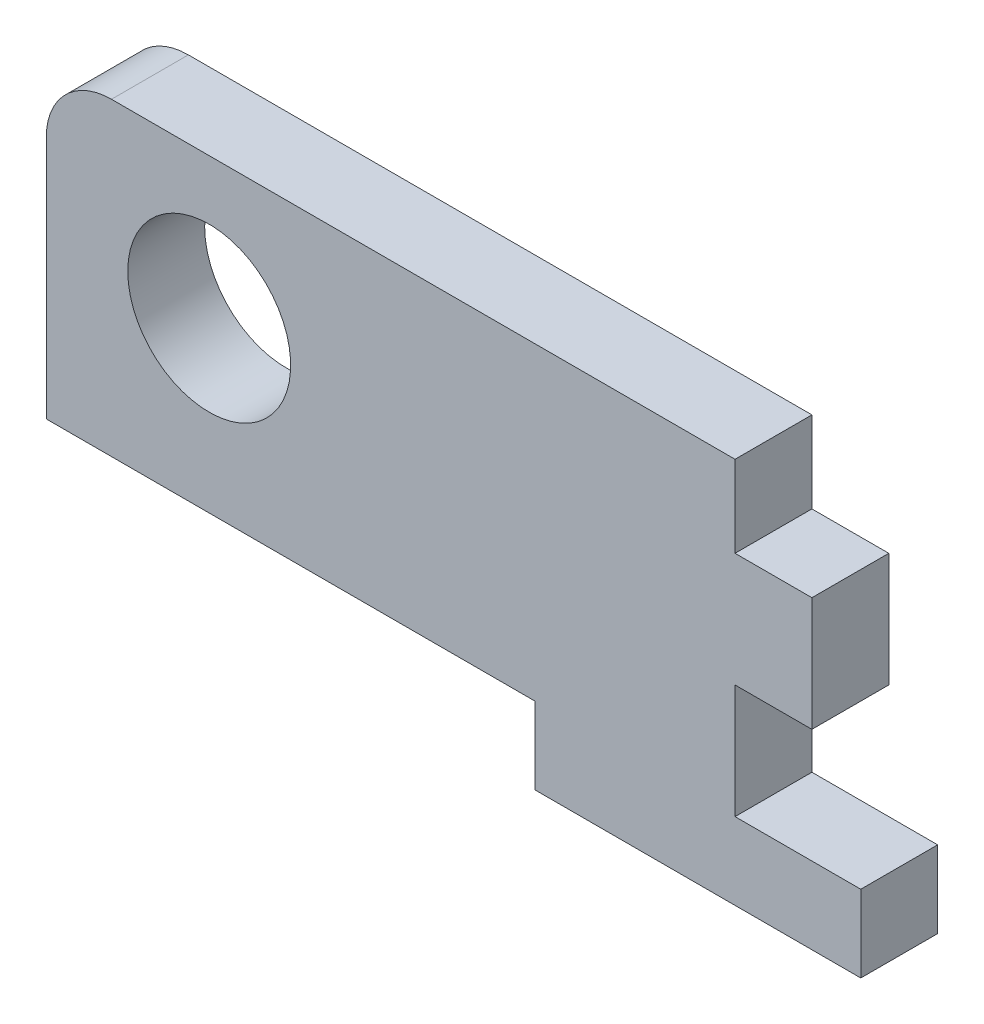
ISO-10303-21;
HEADER;
FILE_DESCRIPTION(('STEP AP214'),'2;1');
FILE_NAME('part.step','',(''),(''),'','','');
FILE_SCHEMA(('AUTOMOTIVE_DESIGN { 1 0 10303 214 1 1 1 1 }'));
ENDSEC;
DATA;
#1=APPLICATION_CONTEXT('core data for automotive mechanical design processes');
#2=APPLICATION_PROTOCOL_DEFINITION('international standard','automotive_design',2000,#1);
#3=PRODUCT_CONTEXT('',#1,'mechanical');
#4=PRODUCT('Part','Part','',(#3));
#5=PRODUCT_RELATED_PRODUCT_CATEGORY('part','',(#4));
#6=PRODUCT_DEFINITION_FORMATION('','',#4);
#7=PRODUCT_DEFINITION_CONTEXT('part definition',#1,'design');
#8=PRODUCT_DEFINITION('design','',#6,#7);
#9=PRODUCT_DEFINITION_SHAPE('','',#8);
#10=(LENGTH_UNIT() NAMED_UNIT(*) SI_UNIT(.MILLI.,.METRE.));
#11=(NAMED_UNIT(*) PLANE_ANGLE_UNIT() SI_UNIT($,.RADIAN.));
#12=(NAMED_UNIT(*) SI_UNIT($,.STERADIAN.) SOLID_ANGLE_UNIT());
#13=UNCERTAINTY_MEASURE_WITH_UNIT(LENGTH_MEASURE(1.E-05),#10,'distance_accuracy_value','');
#14=(GEOMETRIC_REPRESENTATION_CONTEXT(3) GLOBAL_UNCERTAINTY_ASSIGNED_CONTEXT((#13)) GLOBAL_UNIT_ASSIGNED_CONTEXT((#10,
#11,#12)) REPRESENTATION_CONTEXT('',''));
#15=CARTESIAN_POINT('',(0.,0.,0.));
#16=DIRECTION('',(0.,0.,1.));
#17=DIRECTION('',(1.,0.,0.));
#18=AXIS2_PLACEMENT_3D('',#15,#16,#17);
#19=CARTESIAN_POINT('',(0.,1.43811272619839E-13,2.9972));
#20=DIRECTION('',(0.,1.,0.));
#21=DIRECTION('',(-1.,0.,0.));
#22=AXIS2_PLACEMENT_3D('',#19,#20,#21);
#23=PLANE('',#22);
#24=DIRECTION('',(1.,0.,0.));
#25=VECTOR('',#24,1.);
#26=CARTESIAN_POINT('',(0.,1.43811272619839E-13,0.));
#27=LINE('',#26,#25);
#28=CARTESIAN_POINT('',(45.8978,0.,0.));
#29=VERTEX_POINT('',#28);
#30=CARTESIAN_POINT('',(50.8,0.,0.));
#31=VERTEX_POINT('',#30);
#32=EDGE_CURVE('E162',#29,#31,#27,.T.);
#33=ORIENTED_EDGE('',*,*,#32,.F.);
#34=DIRECTION('',(0.,0.,-1.));
#35=VECTOR('',#34,1.);
#36=CARTESIAN_POINT('',(45.8978,0.,2.9972));
#37=LINE('',#36,#35);
#38=CARTESIAN_POINT('',(45.8978,0.,2.9972));
#39=VERTEX_POINT('',#38);
#40=EDGE_CURVE('E11',#39,#29,#37,.T.);
#41=ORIENTED_EDGE('',*,*,#40,.F.);
#42=DIRECTION('',(1.,0.,0.));
#43=VECTOR('',#42,1.);
#44=CARTESIAN_POINT('',(0.,1.43811272619839E-13,2.9972));
#45=LINE('',#44,#43);
#46=CARTESIAN_POINT('',(50.8,0.,2.9972));
#47=VERTEX_POINT('',#46);
#48=EDGE_CURVE('E200',#39,#47,#45,.T.);
#49=ORIENTED_EDGE('',*,*,#48,.T.);
#50=DIRECTION('',(0.,0.,-1.));
#51=VECTOR('',#50,1.);
#52=CARTESIAN_POINT('',(50.8,0.,2.9972));
#53=LINE('',#52,#51);
#54=EDGE_CURVE('E100',#47,#31,#53,.T.);
#55=ORIENTED_EDGE('',*,*,#54,.T.);
#56=EDGE_LOOP('',(#33,#41,#49,#55));
#57=FACE_BOUND('',#56,.T.);
#58=ADVANCED_FACE('F35',(#57),#23,.T.);
#59=CARTESIAN_POINT('',(45.8978,0.,2.9972));
#60=DIRECTION('',(1.,0.,0.));
#61=DIRECTION('',(0.,0.,-1.));
#62=AXIS2_PLACEMENT_3D('',#59,#60,#61);
#63=PLANE('',#62);
#64=DIRECTION('',(0.,-1.,0.));
#65=VECTOR('',#64,1.);
#66=CARTESIAN_POINT('',(45.8978,0.,0.));
#67=LINE('',#66,#65);
#68=CARTESIAN_POINT('',(45.8978,4.44500000000001,0.));
#69=VERTEX_POINT('',#68);
#70=EDGE_CURVE('E165',#69,#29,#67,.T.);
#71=ORIENTED_EDGE('',*,*,#70,.F.);
#72=DIRECTION('',(0.,0.,-1.));
#73=VECTOR('',#72,1.);
#74=CARTESIAN_POINT('',(45.8978,4.44500000000001,2.9972));
#75=LINE('',#74,#73);
#76=CARTESIAN_POINT('',(45.8978,4.44500000000001,2.9972));
#77=VERTEX_POINT('',#76);
#78=EDGE_CURVE('E43',#77,#69,#75,.T.);
#79=ORIENTED_EDGE('',*,*,#78,.F.);
#80=DIRECTION('',(0.,-1.,0.));
#81=VECTOR('',#80,1.);
#82=CARTESIAN_POINT('',(45.8978,0.,2.9972));
#83=LINE('',#82,#81);
#84=EDGE_CURVE('E240',#77,#39,#83,.T.);
#85=ORIENTED_EDGE('',*,*,#84,.T.);
#86=ORIENTED_EDGE('',*,*,#40,.T.);
#87=EDGE_LOOP('',(#71,#79,#85,#86));
#88=FACE_BOUND('',#87,.T.);
#89=ADVANCED_FACE('F227',(#88),#63,.T.);
#90=CARTESIAN_POINT('',(0.,4.44500000000001,2.9972));
#91=DIRECTION('',(0.,-1.,0.));
#92=DIRECTION('',(0.,0.,-1.));
#93=AXIS2_PLACEMENT_3D('',#90,#91,#92);
#94=PLANE('',#93);
#95=DIRECTION('',(-1.,0.,0.));
#96=VECTOR('',#95,1.);
#97=CARTESIAN_POINT('',(0.,4.44500000000001,0.));
#98=LINE('',#97,#96);
#99=CARTESIAN_POINT('',(48.895,4.44500000000001,0.));
#100=VERTEX_POINT('',#99);
#101=EDGE_CURVE('E168',#100,#69,#98,.T.);
#102=ORIENTED_EDGE('',*,*,#101,.F.);
#103=DIRECTION('',(0.,0.,-1.));
#104=VECTOR('',#103,1.);
#105=CARTESIAN_POINT('',(48.895,4.44500000000001,2.9972));
#106=LINE('',#105,#104);
#107=CARTESIAN_POINT('',(48.895,4.44500000000001,2.9972));
#108=VERTEX_POINT('',#107);
#109=EDGE_CURVE('E216',#108,#100,#106,.T.);
#110=ORIENTED_EDGE('',*,*,#109,.F.);
#111=DIRECTION('',(-1.,0.,0.));
#112=VECTOR('',#111,1.);
#113=CARTESIAN_POINT('',(0.,4.44500000000001,2.9972));
#114=LINE('',#113,#112);
#115=EDGE_CURVE('E223',#108,#77,#114,.T.);
#116=ORIENTED_EDGE('',*,*,#115,.T.);
#117=ORIENTED_EDGE('',*,*,#78,.T.);
#118=EDGE_LOOP('',(#102,#110,#116,#117));
#119=FACE_BOUND('',#118,.T.);
#120=ADVANCED_FACE('F221',(#119),#94,.T.);
#121=CARTESIAN_POINT('',(48.895,0.,2.9972));
#122=DIRECTION('',(1.,0.,0.));
#123=DIRECTION('',(0.,0.,-1.));
#124=AXIS2_PLACEMENT_3D('',#121,#122,#123);
#125=PLANE('',#124);
#126=DIRECTION('',(0.,-1.,0.));
#127=VECTOR('',#126,1.);
#128=CARTESIAN_POINT('',(48.895,0.,0.));
#129=LINE('',#128,#127);
#130=CARTESIAN_POINT('',(48.895,8.89000000000001,0.));
#131=VERTEX_POINT('',#130);
#132=EDGE_CURVE('E171',#131,#100,#129,.T.);
#133=ORIENTED_EDGE('',*,*,#132,.F.);
#134=DIRECTION('',(0.,0.,-1.));
#135=VECTOR('',#134,1.);
#136=CARTESIAN_POINT('',(48.895,8.89000000000001,2.9972));
#137=LINE('',#136,#135);
#138=CARTESIAN_POINT('',(48.895,8.89000000000001,2.9972));
#139=VERTEX_POINT('',#138);
#140=EDGE_CURVE('E214',#139,#131,#137,.T.);
#141=ORIENTED_EDGE('',*,*,#140,.F.);
#142=DIRECTION('',(0.,-1.,0.));
#143=VECTOR('',#142,1.);
#144=CARTESIAN_POINT('',(48.895,0.,2.9972));
#145=LINE('',#144,#143);
#146=EDGE_CURVE('E237',#139,#108,#145,.T.);
#147=ORIENTED_EDGE('',*,*,#146,.T.);
#148=ORIENTED_EDGE('',*,*,#109,.T.);
#149=EDGE_LOOP('',(#133,#141,#147,#148));
#150=FACE_BOUND('',#149,.T.);
#151=ADVANCED_FACE('F234',(#150),#125,.T.);
#152=CARTESIAN_POINT('',(0.,8.89000000000001,2.9972));
#153=DIRECTION('',(0.,1.,0.));
#154=DIRECTION('',(0.,0.,1.));
#155=AXIS2_PLACEMENT_3D('',#152,#153,#154);
#156=PLANE('',#155);
#157=DIRECTION('',(1.,0.,0.));
#158=VECTOR('',#157,1.);
#159=CARTESIAN_POINT('',(0.,8.89000000000001,0.));
#160=LINE('',#159,#158);
#161=CARTESIAN_POINT('',(45.8978,8.89000000000001,0.));
#162=VERTEX_POINT('',#161);
#163=EDGE_CURVE('E174',#162,#131,#160,.T.);
#164=ORIENTED_EDGE('',*,*,#163,.F.);
#165=DIRECTION('',(0.,0.,-1.));
#166=VECTOR('',#165,1.);
#167=CARTESIAN_POINT('',(45.8978,8.89000000000001,2.9972));
#168=LINE('',#167,#166);
#169=CARTESIAN_POINT('',(45.8978,8.89000000000001,2.9972));
#170=VERTEX_POINT('',#169);
#171=EDGE_CURVE('E212',#170,#162,#168,.T.);
#172=ORIENTED_EDGE('',*,*,#171,.F.);
#173=DIRECTION('',(1.,0.,0.));
#174=VECTOR('',#173,1.);
#175=CARTESIAN_POINT('',(0.,8.89000000000001,2.9972));
#176=LINE('',#175,#174);
#177=EDGE_CURVE('E242',#170,#139,#176,.T.);
#178=ORIENTED_EDGE('',*,*,#177,.T.);
#179=ORIENTED_EDGE('',*,*,#140,.T.);
#180=EDGE_LOOP('',(#164,#172,#178,#179));
#181=FACE_BOUND('',#180,.T.);
#182=ADVANCED_FACE('F275',(#181),#156,.T.);
#183=CARTESIAN_POINT('',(45.8978,0.,2.9972));
#184=DIRECTION('',(1.,0.,0.));
#185=DIRECTION('',(0.,0.,-1.));
#186=AXIS2_PLACEMENT_3D('',#183,#184,#185);
#187=PLANE('',#186);
#188=DIRECTION('',(0.,-1.,0.));
#189=VECTOR('',#188,1.);
#190=CARTESIAN_POINT('',(45.8978,0.,0.));
#191=LINE('',#190,#189);
#192=CARTESIAN_POINT('',(45.8978,12.065,0.));
#193=VERTEX_POINT('',#192);
#194=EDGE_CURVE('E177',#193,#162,#191,.T.);
#195=ORIENTED_EDGE('',*,*,#194,.F.);
#196=DIRECTION('',(0.,0.,-1.));
#197=VECTOR('',#196,1.);
#198=CARTESIAN_POINT('',(45.8978,12.065,2.9972));
#199=LINE('',#198,#197);
#200=CARTESIAN_POINT('',(45.8978,12.065,2.9972));
#201=VERTEX_POINT('',#200);
#202=EDGE_CURVE('E210',#201,#193,#199,.T.);
#203=ORIENTED_EDGE('',*,*,#202,.F.);
#204=DIRECTION('',(0.,-1.,0.));
#205=VECTOR('',#204,1.);
#206=CARTESIAN_POINT('',(45.8978,0.,2.9972));
#207=LINE('',#206,#205);
#208=EDGE_CURVE('E248',#201,#170,#207,.T.);
#209=ORIENTED_EDGE('',*,*,#208,.T.);
#210=ORIENTED_EDGE('',*,*,#171,.T.);
#211=EDGE_LOOP('',(#195,#203,#209,#210));
#212=FACE_BOUND('',#211,.T.);
#213=ADVANCED_FACE('F278',(#212),#187,.T.);
#214=CARTESIAN_POINT('',(0.,12.065,2.9972));
#215=DIRECTION('',(0.,1.,0.));
#216=DIRECTION('',(-1.,0.,0.));
#217=AXIS2_PLACEMENT_3D('',#214,#215,#216);
#218=PLANE('',#217);
#219=DIRECTION('',(1.,0.,0.));
#220=VECTOR('',#219,1.);
#221=CARTESIAN_POINT('',(0.,12.065,0.));
#222=LINE('',#221,#220);
#223=CARTESIAN_POINT('',(21.59,12.065,0.));
#224=VERTEX_POINT('',#223);
#225=EDGE_CURVE('E180',#224,#193,#222,.T.);
#226=ORIENTED_EDGE('',*,*,#225,.F.);
#227=DIRECTION('',(0.,0.,-1.));
#228=VECTOR('',#227,1.);
#229=CARTESIAN_POINT('',(21.59,12.065,2.9972));
#230=LINE('',#229,#228);
#231=CARTESIAN_POINT('',(21.59,12.065,2.9972));
#232=VERTEX_POINT('',#231);
#233=EDGE_CURVE('E208',#232,#224,#230,.T.);
#234=ORIENTED_EDGE('',*,*,#233,.F.);
#235=DIRECTION('',(1.,0.,0.));
#236=VECTOR('',#235,1.);
#237=CARTESIAN_POINT('',(0.,12.065,2.9972));
#238=LINE('',#237,#236);
#239=EDGE_CURVE('E251',#232,#201,#238,.T.);
#240=ORIENTED_EDGE('',*,*,#239,.T.);
#241=ORIENTED_EDGE('',*,*,#202,.T.);
#242=EDGE_LOOP('',(#226,#234,#240,#241));
#243=FACE_BOUND('',#242,.T.);
#244=ADVANCED_FACE('F282',(#243),#218,.T.);
#245=CARTESIAN_POINT('',(21.59,9.525,2.9972));
#246=DIRECTION('',(0.,0.,-1.));
#247=DIRECTION('',(-1.,0.,0.));
#248=AXIS2_PLACEMENT_3D('',#245,#246,#247);
#249=CYLINDRICAL_SURFACE('',#248,2.53999999999999);
#250=CARTESIAN_POINT('',(21.59,9.525,0.));
#251=DIRECTION('',(0.,0.,1.));
#252=DIRECTION('',(1.,0.,0.));
#253=AXIS2_PLACEMENT_3D('',#250,#251,#252);
#254=CIRCLE('',#253,2.53999999999999);
#255=CARTESIAN_POINT('',(19.05,9.525,0.));
#256=VERTEX_POINT('',#255);
#257=EDGE_CURVE('E183',#256,#224,#254,.F.);
#258=ORIENTED_EDGE('',*,*,#257,.F.);
#259=DIRECTION('',(0.,0.,-1.));
#260=VECTOR('',#259,1.);
#261=CARTESIAN_POINT('',(19.05,9.525,2.9972));
#262=LINE('',#261,#260);
#263=CARTESIAN_POINT('',(19.05,9.525,2.9972));
#264=VERTEX_POINT('',#263);
#265=EDGE_CURVE('E206',#264,#256,#262,.T.);
#266=ORIENTED_EDGE('',*,*,#265,.F.);
#267=CARTESIAN_POINT('',(21.59,9.525,2.9972));
#268=DIRECTION('',(0.,0.,1.));
#269=DIRECTION('',(1.,0.,0.));
#270=AXIS2_PLACEMENT_3D('',#267,#268,#269);
#271=CIRCLE('',#270,2.53999999999999);
#272=EDGE_CURVE('E254',#264,#232,#271,.F.);
#273=ORIENTED_EDGE('',*,*,#272,.T.);
#274=ORIENTED_EDGE('',*,*,#233,.T.);
#275=EDGE_LOOP('',(#258,#266,#273,#274));
#276=FACE_BOUND('',#275,.T.);
#277=ADVANCED_FACE('F286',(#276),#249,.T.);
#278=CARTESIAN_POINT('',(19.05,0.,2.9972));
#279=DIRECTION('',(-1.,0.,0.));
#280=DIRECTION('',(0.,0.,1.));
#281=AXIS2_PLACEMENT_3D('',#278,#279,#280);
#282=PLANE('',#281);
#283=DIRECTION('',(0.,1.,0.));
#284=VECTOR('',#283,1.);
#285=CARTESIAN_POINT('',(19.05,0.,0.));
#286=LINE('',#285,#284);
#287=CARTESIAN_POINT('',(19.05,0.,0.));
#288=VERTEX_POINT('',#287);
#289=EDGE_CURVE('E186',#288,#256,#286,.T.);
#290=ORIENTED_EDGE('',*,*,#289,.F.);
#291=DIRECTION('',(0.,0.,-1.));
#292=VECTOR('',#291,1.);
#293=CARTESIAN_POINT('',(19.05,0.,2.9972));
#294=LINE('',#293,#292);
#295=CARTESIAN_POINT('',(19.05,0.,2.9972));
#296=VERTEX_POINT('',#295);
#297=EDGE_CURVE('E204',#296,#288,#294,.T.);
#298=ORIENTED_EDGE('',*,*,#297,.F.);
#299=DIRECTION('',(0.,1.,0.));
#300=VECTOR('',#299,1.);
#301=CARTESIAN_POINT('',(19.05,0.,2.9972));
#302=LINE('',#301,#300);
#303=EDGE_CURVE('E257',#296,#264,#302,.T.);
#304=ORIENTED_EDGE('',*,*,#303,.T.);
#305=ORIENTED_EDGE('',*,*,#265,.T.);
#306=EDGE_LOOP('',(#290,#298,#304,#305));
#307=FACE_BOUND('',#306,.T.);
#308=ADVANCED_FACE('F290',(#307),#282,.T.);
#309=CARTESIAN_POINT('',(0.,0.,2.9972));
#310=DIRECTION('',(0.,-1.,0.));
#311=DIRECTION('',(1.,0.,0.));
#312=AXIS2_PLACEMENT_3D('',#309,#310,#311);
#313=PLANE('',#312);
#314=DIRECTION('',(-1.,0.,0.));
#315=VECTOR('',#314,1.);
#316=CARTESIAN_POINT('',(0.,0.,0.));
#317=LINE('',#316,#315);
#318=CARTESIAN_POINT('',(38.1,0.,0.));
#319=VERTEX_POINT('',#318);
#320=EDGE_CURVE('E189',#319,#288,#317,.T.);
#321=ORIENTED_EDGE('',*,*,#320,.F.);
#322=DIRECTION('',(0.,0.,-1.));
#323=VECTOR('',#322,1.);
#324=CARTESIAN_POINT('',(38.1,0.,2.9972));
#325=LINE('',#324,#323);
#326=CARTESIAN_POINT('',(38.1,0.,2.9972));
#327=VERTEX_POINT('',#326);
#328=EDGE_CURVE('E144',#327,#319,#325,.T.);
#329=ORIENTED_EDGE('',*,*,#328,.F.);
#330=DIRECTION('',(-1.,0.,0.));
#331=VECTOR('',#330,1.);
#332=CARTESIAN_POINT('',(0.,0.,2.9972));
#333=LINE('',#332,#331);
#334=EDGE_CURVE('E152',#327,#296,#333,.T.);
#335=ORIENTED_EDGE('',*,*,#334,.T.);
#336=ORIENTED_EDGE('',*,*,#297,.T.);
#337=EDGE_LOOP('',(#321,#329,#335,#336));
#338=FACE_BOUND('',#337,.T.);
#339=ADVANCED_FACE('F261',(#338),#313,.T.);
#340=CARTESIAN_POINT('',(38.1,0.,2.9972));
#341=DIRECTION('',(-1.,0.,0.));
#342=DIRECTION('',(0.,0.,1.));
#343=AXIS2_PLACEMENT_3D('',#340,#341,#342);
#344=PLANE('',#343);
#345=DIRECTION('',(0.,1.,0.));
#346=VECTOR('',#345,1.);
#347=CARTESIAN_POINT('',(38.1,0.,0.));
#348=LINE('',#347,#346);
#349=CARTESIAN_POINT('',(38.1,-2.9972,0.));
#350=VERTEX_POINT('',#349);
#351=EDGE_CURVE('E139',#350,#319,#348,.T.);
#352=ORIENTED_EDGE('',*,*,#351,.F.);
#353=DIRECTION('',(0.,0.,-1.));
#354=VECTOR('',#353,1.);
#355=CARTESIAN_POINT('',(38.1,-2.9972,2.9972));
#356=LINE('',#355,#354);
#357=CARTESIAN_POINT('',(38.1,-2.9972,2.9972));
#358=VERTEX_POINT('',#357);
#359=EDGE_CURVE('E134',#358,#350,#356,.T.);
#360=ORIENTED_EDGE('',*,*,#359,.F.);
#361=DIRECTION('',(0.,1.,0.));
#362=VECTOR('',#361,1.);
#363=CARTESIAN_POINT('',(38.1,0.,2.9972));
#364=LINE('',#363,#362);
#365=EDGE_CURVE('E137',#358,#327,#364,.T.);
#366=ORIENTED_EDGE('',*,*,#365,.T.);
#367=ORIENTED_EDGE('',*,*,#328,.T.);
#368=EDGE_LOOP('',(#352,#360,#366,#367));
#369=FACE_BOUND('',#368,.T.);
#370=ADVANCED_FACE('F136',(#369),#344,.T.);
#371=CARTESIAN_POINT('',(0.,-2.9972,2.9972));
#372=DIRECTION('',(0.,-1.,0.));
#373=DIRECTION('',(0.,0.,-1.));
#374=AXIS2_PLACEMENT_3D('',#371,#372,#373);
#375=PLANE('',#374);
#376=DIRECTION('',(-1.,0.,0.));
#377=VECTOR('',#376,1.);
#378=CARTESIAN_POINT('',(0.,-2.9972,0.));
#379=LINE('',#378,#377);
#380=CARTESIAN_POINT('',(50.8,-2.9972,0.));
#381=VERTEX_POINT('',#380);
#382=EDGE_CURVE('E193',#381,#350,#379,.T.);
#383=ORIENTED_EDGE('',*,*,#382,.F.);
#384=DIRECTION('',(0.,0.,-1.));
#385=VECTOR('',#384,1.);
#386=CARTESIAN_POINT('',(50.8,-2.9972,2.9972));
#387=LINE('',#386,#385);
#388=CARTESIAN_POINT('',(50.8,-2.9972,2.9972));
#389=VERTEX_POINT('',#388);
#390=EDGE_CURVE('E93',#389,#381,#387,.T.);
#391=ORIENTED_EDGE('',*,*,#390,.F.);
#392=DIRECTION('',(-1.,0.,0.));
#393=VECTOR('',#392,1.);
#394=CARTESIAN_POINT('',(0.,-2.9972,2.9972));
#395=LINE('',#394,#393);
#396=EDGE_CURVE('E149',#389,#358,#395,.T.);
#397=ORIENTED_EDGE('',*,*,#396,.T.);
#398=ORIENTED_EDGE('',*,*,#359,.T.);
#399=EDGE_LOOP('',(#383,#391,#397,#398));
#400=FACE_BOUND('',#399,.T.);
#401=ADVANCED_FACE('F154',(#400),#375,.T.);
#402=CARTESIAN_POINT('',(50.8,0.,2.9972));
#403=DIRECTION('',(-1.,0.,0.));
#404=DIRECTION('',(0.,0.,1.));
#405=AXIS2_PLACEMENT_3D('',#402,#403,#404);
#406=PLANE('',#405);
#407=DIRECTION('',(0.,1.,0.));
#408=VECTOR('',#407,1.);
#409=CARTESIAN_POINT('',(50.8,0.,0.));
#410=LINE('',#409,#408);
#411=EDGE_CURVE('E195',#381,#31,#410,.T.);
#412=ORIENTED_EDGE('',*,*,#411,.T.);
#413=ORIENTED_EDGE('',*,*,#54,.F.);
#414=DIRECTION('',(0.,1.,0.));
#415=VECTOR('',#414,1.);
#416=CARTESIAN_POINT('',(50.8,0.,2.9972));
#417=LINE('',#416,#415);
#418=EDGE_CURVE('E51',#389,#47,#417,.T.);
#419=ORIENTED_EDGE('',*,*,#418,.F.);
#420=ORIENTED_EDGE('',*,*,#390,.T.);
#421=EDGE_LOOP('',(#412,#413,#419,#420));
#422=FACE_BOUND('',#421,.T.);
#423=ADVANCED_FACE('F263',(#422),#406,.F.);
#424=CARTESIAN_POINT('',(25.4,6.5778,2.9972));
#425=DIRECTION('',(0.,0.,-1.));
#426=DIRECTION('',(-1.,0.,0.));
#427=AXIS2_PLACEMENT_3D('',#424,#425,#426);
#428=CYLINDRICAL_SURFACE('',#427,3.175);
#429=CARTESIAN_POINT('',(25.4,6.5778,2.9972));
#430=DIRECTION('',(0.,0.,1.));
#431=DIRECTION('',(1.,0.,0.));
#432=AXIS2_PLACEMENT_3D('',#429,#430,#431);
#433=CIRCLE('',#432,3.175);
#434=CARTESIAN_POINT('',(22.225,6.5778,2.9972));
#435=VERTEX_POINT('',#434);
#436=EDGE_CURVE('E156',#435,#435,#433,.T.);
#437=CARTESIAN_POINT('',(25.4,6.5778,0.));
#438=DIRECTION('',(0.,0.,1.));
#439=DIRECTION('',(1.,0.,0.));
#440=AXIS2_PLACEMENT_3D('',#437,#438,#439);
#441=CIRCLE('',#440,3.175);
#442=CARTESIAN_POINT('',(22.225,6.5778,0.));
#443=VERTEX_POINT('',#442);
#444=EDGE_CURVE('E197',#443,#443,#441,.T.);
#445=CARTESIAN_POINT('',(22.225,6.5778,2.9972));
#446=CARTESIAN_POINT('',(22.225,6.5778,2.96597916666667));
#447=CARTESIAN_POINT('',(22.225,6.5778,2.93475833333333));
#448=CARTESIAN_POINT('',(22.225,6.5778,2.87231666666667));
#449=CARTESIAN_POINT('',(22.225,6.5778,2.84109583333333));
#450=CARTESIAN_POINT('',(22.225,6.5778,2.77865416666667));
#451=CARTESIAN_POINT('',(22.225,6.5778,2.74743333333333));
#452=CARTESIAN_POINT('',(22.225,6.5778,2.68499166666667));
#453=CARTESIAN_POINT('',(22.225,6.5778,2.65377083333333));
#454=CARTESIAN_POINT('',(22.225,6.5778,2.59132916666667));
#455=CARTESIAN_POINT('',(22.225,6.5778,2.56010833333333));
#456=CARTESIAN_POINT('',(22.225,6.5778,2.49766666666667));
#457=CARTESIAN_POINT('',(22.225,6.5778,2.46644583333333));
#458=CARTESIAN_POINT('',(22.225,6.5778,2.40400416666667));
#459=CARTESIAN_POINT('',(22.225,6.5778,2.37278333333333));
#460=CARTESIAN_POINT('',(22.225,6.5778,2.31034166666667));
#461=CARTESIAN_POINT('',(22.225,6.5778,2.27912083333333));
#462=CARTESIAN_POINT('',(22.225,6.5778,2.21667916666667));
#463=CARTESIAN_POINT('',(22.225,6.5778,2.18545833333333));
#464=CARTESIAN_POINT('',(22.225,6.5778,2.12301666666667));
#465=CARTESIAN_POINT('',(22.225,6.5778,2.09179583333333));
#466=CARTESIAN_POINT('',(22.225,6.5778,2.02935416666667));
#467=CARTESIAN_POINT('',(22.225,6.5778,1.99813333333333));
#468=CARTESIAN_POINT('',(22.225,6.5778,1.93569166666667));
#469=CARTESIAN_POINT('',(22.225,6.5778,1.90447083333333));
#470=CARTESIAN_POINT('',(22.225,6.5778,1.84202916666667));
#471=CARTESIAN_POINT('',(22.225,6.5778,1.81080833333333));
#472=CARTESIAN_POINT('',(22.225,6.5778,1.74836666666667));
#473=CARTESIAN_POINT('',(22.225,6.5778,1.71714583333333));
#474=CARTESIAN_POINT('',(22.225,6.5778,1.65470416666667));
#475=CARTESIAN_POINT('',(22.225,6.5778,1.62348333333333));
#476=CARTESIAN_POINT('',(22.225,6.5778,1.56104166666667));
#477=CARTESIAN_POINT('',(22.225,6.5778,1.52982083333333));
#478=CARTESIAN_POINT('',(22.225,6.5778,1.46737916666667));
#479=CARTESIAN_POINT('',(22.225,6.5778,1.43615833333333));
#480=CARTESIAN_POINT('',(22.225,6.5778,1.37371666666667));
#481=CARTESIAN_POINT('',(22.225,6.5778,1.34249583333333));
#482=CARTESIAN_POINT('',(22.225,6.5778,1.28005416666667));
#483=CARTESIAN_POINT('',(22.225,6.5778,1.24883333333333));
#484=CARTESIAN_POINT('',(22.225,6.5778,1.18639166666667));
#485=CARTESIAN_POINT('',(22.225,6.5778,1.15517083333333));
#486=CARTESIAN_POINT('',(22.225,6.5778,1.09272916666667));
#487=CARTESIAN_POINT('',(22.225,6.5778,1.06150833333333));
#488=CARTESIAN_POINT('',(22.225,6.5778,0.999066666666667));
#489=CARTESIAN_POINT('',(22.225,6.5778,0.967845833333333));
#490=CARTESIAN_POINT('',(22.225,6.5778,0.905404166666667));
#491=CARTESIAN_POINT('',(22.225,6.5778,0.874183333333333));
#492=CARTESIAN_POINT('',(22.225,6.5778,0.811741666666667));
#493=CARTESIAN_POINT('',(22.225,6.5778,0.780520833333333));
#494=CARTESIAN_POINT('',(22.225,6.5778,0.718079166666667));
#495=CARTESIAN_POINT('',(22.225,6.5778,0.686858333333333));
#496=CARTESIAN_POINT('',(22.225,6.5778,0.624416666666667));
#497=CARTESIAN_POINT('',(22.225,6.5778,0.593195833333333));
#498=CARTESIAN_POINT('',(22.225,6.5778,0.530754166666667));
#499=CARTESIAN_POINT('',(22.225,6.5778,0.499533333333333));
#500=CARTESIAN_POINT('',(22.225,6.5778,0.437091666666667));
#501=CARTESIAN_POINT('',(22.225,6.5778,0.405870833333333));
#502=CARTESIAN_POINT('',(22.225,6.5778,0.343429166666667));
#503=CARTESIAN_POINT('',(22.225,6.5778,0.312208333333333));
#504=CARTESIAN_POINT('',(22.225,6.5778,0.249766666666667));
#505=CARTESIAN_POINT('',(22.225,6.5778,0.218545833333333));
#506=CARTESIAN_POINT('',(22.225,6.5778,0.156104166666667));
#507=CARTESIAN_POINT('',(22.225,6.5778,0.124883333333333));
#508=CARTESIAN_POINT('',(22.225,6.5778,0.0624416666666668));
#509=CARTESIAN_POINT('',(22.225,6.5778,0.0312208333333333));
#510=CARTESIAN_POINT('',(22.225,6.5778,0.));
#511=B_SPLINE_CURVE_WITH_KNOTS('',3,(#445,#446,#447,#448,#449,#450,#451,#452,#453,#454,#455,
#456,#457,#458,#459,#460,#461,#462,#463,#464,#465,#466,#467,#468,#469,#470,#471,#472,#473,#474,
#475,#476,#477,#478,#479,#480,#481,#482,#483,#484,#485,#486,#487,#488,#489,#490,#491,#492,#493,
#494,#495,#496,#497,#498,#499,#500,#501,#502,#503,#504,#505,#506,#507,#508,#509,#510),
.UNSPECIFIED.,.F.,.F.,(4,2,2,2,2,2,2,2,2,2,2,2,2,2,2,2,2,2,2,2,2,2,2,2,2,2,2,2,2,2,2,2,4),(0.,
0.0936624999999997,0.187325,0.2809875,0.37465,0.4683125,0.561975,0.655637499999999,0.7493,
0.8429625,0.936624999999999,1.0302875,1.12395,1.2176125,1.311275,1.4049375,1.4986,1.5922625,
1.685925,1.7795875,1.87325,1.9669125,2.060575,2.1542375,2.2479,2.3415625,2.435225,2.5288875,
2.62255,2.7162125,2.809875,2.9035375,2.9972),.UNSPECIFIED.);
#512=EDGE_CURVE('BSEAM303',#435,#443,#511,.T.);
#513=ORIENTED_EDGE('',*,*,#436,.T.);
#514=ORIENTED_EDGE('',*,*,#444,.F.);
#515=ORIENTED_EDGE('',*,*,#512,.T.);
#516=ORIENTED_EDGE('',*,*,#512,.F.);
#517=EDGE_LOOP('',(#513,#515,#514,#516));
#518=FACE_BOUND('',#517,.T.);
#519=ADVANCED_FACE('F303',(#518),#428,.F.);
#520=CARTESIAN_POINT('',(0.,0.,2.9972));
#521=DIRECTION('',(0.,0.,1.));
#522=DIRECTION('',(1.,0.,0.));
#523=AXIS2_PLACEMENT_3D('',#520,#521,#522);
#524=PLANE('',#523);
#525=ORIENTED_EDGE('',*,*,#48,.F.);
#526=ORIENTED_EDGE('',*,*,#84,.F.);
#527=ORIENTED_EDGE('',*,*,#115,.F.);
#528=ORIENTED_EDGE('',*,*,#146,.F.);
#529=ORIENTED_EDGE('',*,*,#177,.F.);
#530=ORIENTED_EDGE('',*,*,#208,.F.);
#531=ORIENTED_EDGE('',*,*,#239,.F.);
#532=ORIENTED_EDGE('',*,*,#272,.F.);
#533=ORIENTED_EDGE('',*,*,#303,.F.);
#534=ORIENTED_EDGE('',*,*,#334,.F.);
#535=ORIENTED_EDGE('',*,*,#365,.F.);
#536=ORIENTED_EDGE('',*,*,#396,.F.);
#537=ORIENTED_EDGE('',*,*,#418,.T.);
#538=EDGE_LOOP('',(#525,#526,#527,#528,#529,#530,#531,#532,#533,#534,#535,#536,#537));
#539=FACE_BOUND('',#538,.T.);
#540=ORIENTED_EDGE('',*,*,#436,.F.);
#541=EDGE_LOOP('',(#540));
#542=FACE_BOUND('',#541,.T.);
#543=ADVANCED_FACE('F147',(#539,#542),#524,.T.);
#544=CARTESIAN_POINT('',(0.,0.,0.));
#545=DIRECTION('',(0.,0.,1.));
#546=DIRECTION('',(1.,0.,0.));
#547=AXIS2_PLACEMENT_3D('',#544,#545,#546);
#548=PLANE('',#547);
#549=ORIENTED_EDGE('',*,*,#32,.T.);
#550=ORIENTED_EDGE('',*,*,#411,.F.);
#551=ORIENTED_EDGE('',*,*,#382,.T.);
#552=ORIENTED_EDGE('',*,*,#351,.T.);
#553=ORIENTED_EDGE('',*,*,#320,.T.);
#554=ORIENTED_EDGE('',*,*,#289,.T.);
#555=ORIENTED_EDGE('',*,*,#257,.T.);
#556=ORIENTED_EDGE('',*,*,#225,.T.);
#557=ORIENTED_EDGE('',*,*,#194,.T.);
#558=ORIENTED_EDGE('',*,*,#163,.T.);
#559=ORIENTED_EDGE('',*,*,#132,.T.);
#560=ORIENTED_EDGE('',*,*,#101,.T.);
#561=ORIENTED_EDGE('',*,*,#70,.T.);
#562=EDGE_LOOP('',(#549,#550,#551,#552,#553,#554,#555,#556,#557,#558,#559,#560,#561));
#563=FACE_BOUND('',#562,.T.);
#564=ORIENTED_EDGE('',*,*,#444,.T.);
#565=EDGE_LOOP('',(#564));
#566=FACE_BOUND('',#565,.T.);
#567=ADVANCED_FACE('F229',(#563,#566),#548,.F.);
#568=CLOSED_SHELL('',(#58,#89,#120,#151,#182,#213,#244,#277,#308,#339,#370,#401,#423,#519,#543,#567));
#569=MANIFOLD_SOLID_BREP('B2',#568);
#570=ADVANCED_BREP_SHAPE_REPRESENTATION('',(#18,#569),#14);
#571=SHAPE_DEFINITION_REPRESENTATION(#9,#570);
ENDSEC;
END-ISO-10303-21;
